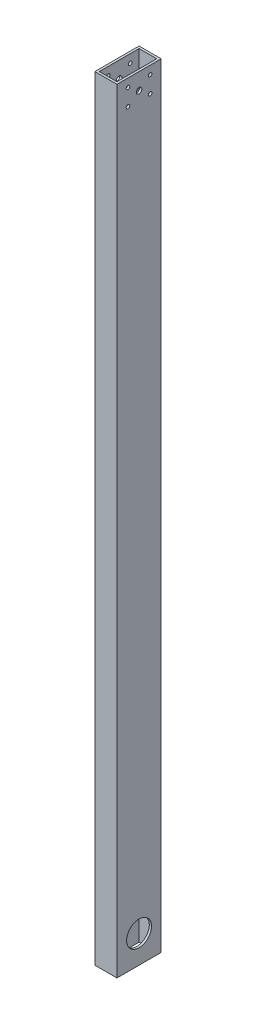
ISO-10303-21;
HEADER;
FILE_DESCRIPTION(('STEP AP214'),'2;1');
FILE_NAME('part.step','',(''),(''),'','','');
FILE_SCHEMA(('AUTOMOTIVE_DESIGN { 1 0 10303 214 1 1 1 1 }'));
ENDSEC;
DATA;
#1=APPLICATION_CONTEXT('core data for automotive mechanical design processes');
#2=APPLICATION_PROTOCOL_DEFINITION('international standard','automotive_design',2000,#1);
#3=PRODUCT_CONTEXT('',#1,'mechanical');
#4=PRODUCT('Part','Part','',(#3));
#5=PRODUCT_RELATED_PRODUCT_CATEGORY('part','',(#4));
#6=PRODUCT_DEFINITION_FORMATION('','',#4);
#7=PRODUCT_DEFINITION_CONTEXT('part definition',#1,'design');
#8=PRODUCT_DEFINITION('design','',#6,#7);
#9=PRODUCT_DEFINITION_SHAPE('','',#8);
#10=(LENGTH_UNIT() NAMED_UNIT(*) SI_UNIT(.MILLI.,.METRE.));
#11=(NAMED_UNIT(*) PLANE_ANGLE_UNIT() SI_UNIT($,.RADIAN.));
#12=(NAMED_UNIT(*) SI_UNIT($,.STERADIAN.) SOLID_ANGLE_UNIT());
#13=UNCERTAINTY_MEASURE_WITH_UNIT(LENGTH_MEASURE(1.E-05),#10,'distance_accuracy_value','');
#14=(GEOMETRIC_REPRESENTATION_CONTEXT(3) GLOBAL_UNCERTAINTY_ASSIGNED_CONTEXT((#13)) GLOBAL_UNIT_ASSIGNED_CONTEXT((#10,
#11,#12)) REPRESENTATION_CONTEXT('',''));
#15=CARTESIAN_POINT('',(0.,0.,0.));
#16=DIRECTION('',(0.,0.,1.));
#17=DIRECTION('',(1.,0.,0.));
#18=AXIS2_PLACEMENT_3D('',#15,#16,#17);
#19=CARTESIAN_POINT('',(12.7,889.,-25.4));
#20=DIRECTION('',(-1.,0.,0.));
#21=DIRECTION('',(0.,0.,1.));
#22=AXIS2_PLACEMENT_3D('',#19,#20,#21);
#23=PLANE('',#22);
#24=CARTESIAN_POINT('',(12.7,879.475,-12.6999999999998));
#25=DIRECTION('',(-1.,0.,0.));
#26=DIRECTION('',(0.,0.,1.));
#27=AXIS2_PLACEMENT_3D('',#24,#25,#26);
#28=CIRCLE('',#27,2.07);
#29=CARTESIAN_POINT('',(12.7,879.475,-10.6299999999998));
#30=VERTEX_POINT('',#29);
#31=EDGE_CURVE('E256',#30,#30,#28,.T.);
#32=ORIENTED_EDGE('',*,*,#31,.T.);
#33=EDGE_LOOP('',(#32));
#34=FACE_BOUND('',#33,.T.);
#35=CARTESIAN_POINT('',(12.7,860.425,-12.6999999999997));
#36=DIRECTION('',(-1.,0.,0.));
#37=DIRECTION('',(0.,0.,1.));
#38=AXIS2_PLACEMENT_3D('',#35,#36,#37);
#39=CIRCLE('',#38,2.07);
#40=CARTESIAN_POINT('',(12.7,860.425,-10.6299999999997));
#41=VERTEX_POINT('',#40);
#42=EDGE_CURVE('E237',#41,#41,#39,.T.);
#43=ORIENTED_EDGE('',*,*,#42,.T.);
#44=EDGE_LOOP('',(#43));
#45=FACE_BOUND('',#44,.T.);
#46=CARTESIAN_POINT('',(12.7,869.95,2.52402265754625E-13));
#47=DIRECTION('',(-1.,0.,0.));
#48=DIRECTION('',(0.,0.,1.));
#49=AXIS2_PLACEMENT_3D('',#46,#47,#48);
#50=CIRCLE('',#49,3.175);
#51=CARTESIAN_POINT('',(12.7,869.95,3.17500000000025));
#52=VERTEX_POINT('',#51);
#53=EDGE_CURVE('E230',#52,#52,#50,.T.);
#54=ORIENTED_EDGE('',*,*,#53,.T.);
#55=EDGE_LOOP('',(#54));
#56=FACE_BOUND('',#55,.T.);
#57=CARTESIAN_POINT('',(12.7,860.425,12.7000000000003));
#58=DIRECTION('',(-1.,0.,0.));
#59=DIRECTION('',(0.,0.,1.));
#60=AXIS2_PLACEMENT_3D('',#57,#58,#59);
#61=CIRCLE('',#60,2.07);
#62=CARTESIAN_POINT('',(12.7,860.425,14.7700000000003));
#63=VERTEX_POINT('',#62);
#64=EDGE_CURVE('E225',#63,#63,#61,.T.);
#65=ORIENTED_EDGE('',*,*,#64,.T.);
#66=EDGE_LOOP('',(#65));
#67=FACE_BOUND('',#66,.T.);
#68=CARTESIAN_POINT('',(12.7,879.475,12.7000000000003));
#69=DIRECTION('',(-1.,0.,0.));
#70=DIRECTION('',(0.,0.,1.));
#71=AXIS2_PLACEMENT_3D('',#68,#69,#70);
#72=CIRCLE('',#71,2.07);
#73=CARTESIAN_POINT('',(12.7,879.475,14.7700000000003));
#74=VERTEX_POINT('',#73);
#75=EDGE_CURVE('E220',#74,#74,#72,.T.);
#76=ORIENTED_EDGE('',*,*,#75,.T.);
#77=EDGE_LOOP('',(#76));
#78=FACE_BOUND('',#77,.T.);
#79=CARTESIAN_POINT('',(12.7,31.75,0.));
#80=DIRECTION('',(-1.,0.,0.));
#81=DIRECTION('',(0.,0.,1.));
#82=AXIS2_PLACEMENT_3D('',#79,#80,#81);
#83=CIRCLE('',#82,14.2875);
#84=CARTESIAN_POINT('',(12.7,31.75,14.2875));
#85=VERTEX_POINT('',#84);
#86=EDGE_CURVE('E165',#85,#85,#83,.T.);
#87=ORIENTED_EDGE('',*,*,#86,.T.);
#88=EDGE_LOOP('',(#87));
#89=FACE_BOUND('',#88,.T.);
#90=DIRECTION('',(0.,0.,-1.));
#91=VECTOR('',#90,1.);
#92=CARTESIAN_POINT('',(12.7,0.,-25.4));
#93=LINE('',#92,#91);
#94=CARTESIAN_POINT('',(12.7,0.,25.4));
#95=VERTEX_POINT('',#94);
#96=CARTESIAN_POINT('',(12.7,0.,-25.4));
#97=VERTEX_POINT('',#96);
#98=EDGE_CURVE('E177',#95,#97,#93,.T.);
#99=ORIENTED_EDGE('',*,*,#98,.T.);
#100=DIRECTION('',(0.,-1.,0.));
#101=VECTOR('',#100,1.);
#102=CARTESIAN_POINT('',(12.7,889.,-25.4));
#103=LINE('',#102,#101);
#104=CARTESIAN_POINT('',(12.7,889.,-25.4));
#105=VERTEX_POINT('',#104);
#106=EDGE_CURVE('E12',#105,#97,#103,.T.);
#107=ORIENTED_EDGE('',*,*,#106,.F.);
#108=DIRECTION('',(0.,0.,-1.));
#109=VECTOR('',#108,1.);
#110=CARTESIAN_POINT('',(12.7,889.,-25.4));
#111=LINE('',#110,#109);
#112=CARTESIAN_POINT('',(12.7,889.,25.4));
#113=VERTEX_POINT('',#112);
#114=EDGE_CURVE('E141',#113,#105,#111,.T.);
#115=ORIENTED_EDGE('',*,*,#114,.F.);
#116=DIRECTION('',(0.,-1.,0.));
#117=VECTOR('',#116,1.);
#118=CARTESIAN_POINT('',(12.7,889.,25.4));
#119=LINE('',#118,#117);
#120=EDGE_CURVE('E188',#113,#95,#119,.T.);
#121=ORIENTED_EDGE('',*,*,#120,.T.);
#122=EDGE_LOOP('',(#99,#107,#115,#121));
#123=FACE_BOUND('',#122,.T.);
#124=ADVANCED_FACE('F58',(#34,#45,#56,#67,#78,#89,#123),#23,.F.);
#125=CARTESIAN_POINT('',(-12.7,889.,-25.4));
#126=DIRECTION('',(0.,0.,1.));
#127=DIRECTION('',(1.,0.,0.));
#128=AXIS2_PLACEMENT_3D('',#125,#126,#127);
#129=PLANE('',#128);
#130=DIRECTION('',(-1.,0.,0.));
#131=VECTOR('',#130,1.);
#132=CARTESIAN_POINT('',(-12.7,0.,-25.4));
#133=LINE('',#132,#131);
#134=CARTESIAN_POINT('',(-12.7,0.,-25.4));
#135=VERTEX_POINT('',#134);
#136=EDGE_CURVE('E147',#97,#135,#133,.T.);
#137=ORIENTED_EDGE('',*,*,#136,.T.);
#138=DIRECTION('',(0.,-1.,0.));
#139=VECTOR('',#138,1.);
#140=CARTESIAN_POINT('',(-12.7,889.,-25.4));
#141=LINE('',#140,#139);
#142=CARTESIAN_POINT('',(-12.7,889.,-25.4));
#143=VERTEX_POINT('',#142);
#144=EDGE_CURVE('E69',#143,#135,#141,.T.);
#145=ORIENTED_EDGE('',*,*,#144,.F.);
#146=DIRECTION('',(-1.,0.,0.));
#147=VECTOR('',#146,1.);
#148=CARTESIAN_POINT('',(-12.7,889.,-25.4));
#149=LINE('',#148,#147);
#150=EDGE_CURVE('E135',#105,#143,#149,.T.);
#151=ORIENTED_EDGE('',*,*,#150,.F.);
#152=ORIENTED_EDGE('',*,*,#106,.T.);
#153=EDGE_LOOP('',(#137,#145,#151,#152));
#154=FACE_BOUND('',#153,.T.);
#155=ADVANCED_FACE('F146',(#154),#129,.F.);
#156=CARTESIAN_POINT('',(-12.7,889.,-25.4));
#157=DIRECTION('',(1.,0.,0.));
#158=DIRECTION('',(0.,0.,-1.));
#159=AXIS2_PLACEMENT_3D('',#156,#157,#158);
#160=PLANE('',#159);
#161=CARTESIAN_POINT('',(-12.7,879.475,-12.6999999999998));
#162=DIRECTION('',(1.,0.,0.));
#163=DIRECTION('',(0.,0.,-1.));
#164=AXIS2_PLACEMENT_3D('',#161,#162,#163);
#165=CIRCLE('',#164,2.07);
#166=CARTESIAN_POINT('',(-12.7,879.475,-14.7699999999998));
#167=VERTEX_POINT('',#166);
#168=EDGE_CURVE('E426',#167,#167,#165,.T.);
#169=ORIENTED_EDGE('',*,*,#168,.T.);
#170=EDGE_LOOP('',(#169));
#171=FACE_BOUND('',#170,.T.);
#172=CARTESIAN_POINT('',(-12.7,860.425,-12.6999999999997));
#173=DIRECTION('',(1.,0.,0.));
#174=DIRECTION('',(0.,0.,-1.));
#175=AXIS2_PLACEMENT_3D('',#172,#173,#174);
#176=CIRCLE('',#175,2.07);
#177=CARTESIAN_POINT('',(-12.7,860.425,-14.7699999999997));
#178=VERTEX_POINT('',#177);
#179=EDGE_CURVE('E430',#178,#178,#176,.T.);
#180=ORIENTED_EDGE('',*,*,#179,.T.);
#181=EDGE_LOOP('',(#180));
#182=FACE_BOUND('',#181,.T.);
#183=CARTESIAN_POINT('',(-12.7,869.95,2.56739074444567E-13));
#184=DIRECTION('',(1.,0.,0.));
#185=DIRECTION('',(0.,0.,-1.));
#186=AXIS2_PLACEMENT_3D('',#183,#184,#185);
#187=CIRCLE('',#186,3.175);
#188=CARTESIAN_POINT('',(-12.7,869.95,-3.17499999999974));
#189=VERTEX_POINT('',#188);
#190=EDGE_CURVE('E434',#189,#189,#187,.T.);
#191=ORIENTED_EDGE('',*,*,#190,.T.);
#192=EDGE_LOOP('',(#191));
#193=FACE_BOUND('',#192,.T.);
#194=CARTESIAN_POINT('',(-12.7,860.425,12.7000000000003));
#195=DIRECTION('',(1.,0.,0.));
#196=DIRECTION('',(0.,0.,-1.));
#197=AXIS2_PLACEMENT_3D('',#194,#195,#196);
#198=CIRCLE('',#197,2.07);
#199=CARTESIAN_POINT('',(-12.7,860.425,10.6300000000003));
#200=VERTEX_POINT('',#199);
#201=EDGE_CURVE('E425',#200,#200,#198,.T.);
#202=ORIENTED_EDGE('',*,*,#201,.T.);
#203=EDGE_LOOP('',(#202));
#204=FACE_BOUND('',#203,.T.);
#205=CARTESIAN_POINT('',(-12.7,879.475,12.7000000000003));
#206=DIRECTION('',(1.,0.,0.));
#207=DIRECTION('',(0.,0.,-1.));
#208=AXIS2_PLACEMENT_3D('',#205,#206,#207);
#209=CIRCLE('',#208,2.07);
#210=CARTESIAN_POINT('',(-12.7,879.475,10.6300000000003));
#211=VERTEX_POINT('',#210);
#212=EDGE_CURVE('E214',#211,#211,#209,.T.);
#213=ORIENTED_EDGE('',*,*,#212,.T.);
#214=EDGE_LOOP('',(#213));
#215=FACE_BOUND('',#214,.T.);
#216=CARTESIAN_POINT('',(-12.7,31.75,0.));
#217=DIRECTION('',(1.,0.,0.));
#218=DIRECTION('',(0.,0.,-1.));
#219=AXIS2_PLACEMENT_3D('',#216,#217,#218);
#220=CIRCLE('',#219,14.2875);
#221=CARTESIAN_POINT('',(-12.7,31.75,-14.2875));
#222=VERTEX_POINT('',#221);
#223=EDGE_CURVE('E208',#222,#222,#220,.T.);
#224=ORIENTED_EDGE('',*,*,#223,.T.);
#225=EDGE_LOOP('',(#224));
#226=FACE_BOUND('',#225,.T.);
#227=DIRECTION('',(0.,0.,1.));
#228=VECTOR('',#227,1.);
#229=CARTESIAN_POINT('',(-12.7,0.,-25.4));
#230=LINE('',#229,#228);
#231=CARTESIAN_POINT('',(-12.7,0.,25.4));
#232=VERTEX_POINT('',#231);
#233=EDGE_CURVE('E107',#135,#232,#230,.T.);
#234=ORIENTED_EDGE('',*,*,#233,.T.);
#235=DIRECTION('',(0.,-1.,0.));
#236=VECTOR('',#235,1.);
#237=CARTESIAN_POINT('',(-12.7,889.,25.4));
#238=LINE('',#237,#236);
#239=CARTESIAN_POINT('',(-12.7,889.,25.4));
#240=VERTEX_POINT('',#239);
#241=EDGE_CURVE('E149',#240,#232,#238,.T.);
#242=ORIENTED_EDGE('',*,*,#241,.F.);
#243=DIRECTION('',(0.,0.,1.));
#244=VECTOR('',#243,1.);
#245=CARTESIAN_POINT('',(-12.7,889.,-25.4));
#246=LINE('',#245,#244);
#247=EDGE_CURVE('E139',#143,#240,#246,.T.);
#248=ORIENTED_EDGE('',*,*,#247,.F.);
#249=ORIENTED_EDGE('',*,*,#144,.T.);
#250=EDGE_LOOP('',(#234,#242,#248,#249));
#251=FACE_BOUND('',#250,.T.);
#252=ADVANCED_FACE('F151',(#171,#182,#193,#204,#215,#226,#251),#160,.F.);
#253=CARTESIAN_POINT('',(-10.16,889.,-22.86));
#254=DIRECTION('',(0.,0.,1.));
#255=DIRECTION('',(1.,0.,0.));
#256=AXIS2_PLACEMENT_3D('',#253,#254,#255);
#257=PLANE('',#256);
#258=DIRECTION('',(-1.,0.,0.));
#259=VECTOR('',#258,1.);
#260=CARTESIAN_POINT('',(-10.16,0.,-22.86));
#261=LINE('',#260,#259);
#262=CARTESIAN_POINT('',(10.16,0.,-22.86));
#263=VERTEX_POINT('',#262);
#264=CARTESIAN_POINT('',(-10.16,0.,-22.86));
#265=VERTEX_POINT('',#264);
#266=EDGE_CURVE('E160',#263,#265,#261,.T.);
#267=ORIENTED_EDGE('',*,*,#266,.F.);
#268=DIRECTION('',(0.,-1.,0.));
#269=VECTOR('',#268,1.);
#270=CARTESIAN_POINT('',(10.16,889.,-22.86));
#271=LINE('',#270,#269);
#272=CARTESIAN_POINT('',(10.16,889.,-22.86));
#273=VERTEX_POINT('',#272);
#274=EDGE_CURVE('E121',#273,#263,#271,.T.);
#275=ORIENTED_EDGE('',*,*,#274,.F.);
#276=DIRECTION('',(-1.,0.,0.));
#277=VECTOR('',#276,1.);
#278=CARTESIAN_POINT('',(-10.16,889.,-22.86));
#279=LINE('',#278,#277);
#280=CARTESIAN_POINT('',(-10.16,889.,-22.86));
#281=VERTEX_POINT('',#280);
#282=EDGE_CURVE('E187',#273,#281,#279,.T.);
#283=ORIENTED_EDGE('',*,*,#282,.T.);
#284=DIRECTION('',(0.,-1.,0.));
#285=VECTOR('',#284,1.);
#286=CARTESIAN_POINT('',(-10.16,889.,-22.86));
#287=LINE('',#286,#285);
#288=EDGE_CURVE('E156',#281,#265,#287,.T.);
#289=ORIENTED_EDGE('',*,*,#288,.T.);
#290=EDGE_LOOP('',(#267,#275,#283,#289));
#291=FACE_BOUND('',#290,.T.);
#292=ADVANCED_FACE('F60',(#291),#257,.T.);
#293=CARTESIAN_POINT('',(10.16,889.,-22.86));
#294=DIRECTION('',(-1.,0.,0.));
#295=DIRECTION('',(0.,0.,1.));
#296=AXIS2_PLACEMENT_3D('',#293,#294,#295);
#297=PLANE('',#296);
#298=CARTESIAN_POINT('',(10.16,879.475,-12.6999999999998));
#299=DIRECTION('',(-1.,0.,0.));
#300=DIRECTION('',(0.,0.,1.));
#301=AXIS2_PLACEMENT_3D('',#298,#299,#300);
#302=CIRCLE('',#301,2.07);
#303=CARTESIAN_POINT('',(10.16,879.475,-10.6299999999998));
#304=VERTEX_POINT('',#303);
#305=EDGE_CURVE('E252',#304,#304,#302,.T.);
#306=ORIENTED_EDGE('',*,*,#305,.F.);
#307=EDGE_LOOP('',(#306));
#308=FACE_BOUND('',#307,.T.);
#309=CARTESIAN_POINT('',(10.16,860.425,-12.6999999999997));
#310=DIRECTION('',(-1.,0.,0.));
#311=DIRECTION('',(0.,0.,1.));
#312=AXIS2_PLACEMENT_3D('',#309,#310,#311);
#313=CIRCLE('',#312,2.07);
#314=CARTESIAN_POINT('',(10.16,860.425,-10.6299999999997));
#315=VERTEX_POINT('',#314);
#316=EDGE_CURVE('E229',#315,#315,#313,.T.);
#317=ORIENTED_EDGE('',*,*,#316,.F.);
#318=EDGE_LOOP('',(#317));
#319=FACE_BOUND('',#318,.T.);
#320=CARTESIAN_POINT('',(10.16,869.95,2.52402265754625E-13));
#321=DIRECTION('',(-1.,0.,0.));
#322=DIRECTION('',(0.,0.,1.));
#323=AXIS2_PLACEMENT_3D('',#320,#321,#322);
#324=CIRCLE('',#323,3.175);
#325=CARTESIAN_POINT('',(10.16,869.95,3.17500000000025));
#326=VERTEX_POINT('',#325);
#327=EDGE_CURVE('E224',#326,#326,#324,.T.);
#328=ORIENTED_EDGE('',*,*,#327,.F.);
#329=EDGE_LOOP('',(#328));
#330=FACE_BOUND('',#329,.T.);
#331=CARTESIAN_POINT('',(10.16,860.425,12.7000000000003));
#332=DIRECTION('',(-1.,0.,0.));
#333=DIRECTION('',(0.,0.,1.));
#334=AXIS2_PLACEMENT_3D('',#331,#332,#333);
#335=CIRCLE('',#334,2.07);
#336=CARTESIAN_POINT('',(10.16,860.425,14.7700000000003));
#337=VERTEX_POINT('',#336);
#338=EDGE_CURVE('E219',#337,#337,#335,.T.);
#339=ORIENTED_EDGE('',*,*,#338,.F.);
#340=EDGE_LOOP('',(#339));
#341=FACE_BOUND('',#340,.T.);
#342=CARTESIAN_POINT('',(10.16,879.475,12.7000000000003));
#343=DIRECTION('',(-1.,0.,0.));
#344=DIRECTION('',(0.,0.,1.));
#345=AXIS2_PLACEMENT_3D('',#342,#343,#344);
#346=CIRCLE('',#345,2.07);
#347=CARTESIAN_POINT('',(10.16,879.475,14.7700000000003));
#348=VERTEX_POINT('',#347);
#349=EDGE_CURVE('E213',#348,#348,#346,.T.);
#350=ORIENTED_EDGE('',*,*,#349,.F.);
#351=EDGE_LOOP('',(#350));
#352=FACE_BOUND('',#351,.T.);
#353=CARTESIAN_POINT('',(10.16,31.75,0.));
#354=DIRECTION('',(-1.,0.,0.));
#355=DIRECTION('',(0.,0.,1.));
#356=AXIS2_PLACEMENT_3D('',#353,#354,#355);
#357=CIRCLE('',#356,14.2875);
#358=CARTESIAN_POINT('',(10.16,31.75,14.2875));
#359=VERTEX_POINT('',#358);
#360=EDGE_CURVE('E207',#359,#359,#357,.T.);
#361=ORIENTED_EDGE('',*,*,#360,.F.);
#362=EDGE_LOOP('',(#361));
#363=FACE_BOUND('',#362,.T.);
#364=DIRECTION('',(0.,0.,-1.));
#365=VECTOR('',#364,1.);
#366=CARTESIAN_POINT('',(10.16,0.,-22.86));
#367=LINE('',#366,#365);
#368=CARTESIAN_POINT('',(10.16,0.,22.86));
#369=VERTEX_POINT('',#368);
#370=EDGE_CURVE('E164',#369,#263,#367,.T.);
#371=ORIENTED_EDGE('',*,*,#370,.F.);
#372=DIRECTION('',(0.,-1.,0.));
#373=VECTOR('',#372,1.);
#374=CARTESIAN_POINT('',(10.16,889.,22.86));
#375=LINE('',#374,#373);
#376=CARTESIAN_POINT('',(10.16,889.,22.86));
#377=VERTEX_POINT('',#376);
#378=EDGE_CURVE('E198',#377,#369,#375,.T.);
#379=ORIENTED_EDGE('',*,*,#378,.F.);
#380=DIRECTION('',(0.,0.,-1.));
#381=VECTOR('',#380,1.);
#382=CARTESIAN_POINT('',(10.16,889.,-22.86));
#383=LINE('',#382,#381);
#384=EDGE_CURVE('E271',#377,#273,#383,.T.);
#385=ORIENTED_EDGE('',*,*,#384,.T.);
#386=ORIENTED_EDGE('',*,*,#274,.T.);
#387=EDGE_LOOP('',(#371,#379,#385,#386));
#388=FACE_BOUND('',#387,.T.);
#389=ADVANCED_FACE('F340',(#308,#319,#330,#341,#352,#363,#388),#297,.T.);
#390=CARTESIAN_POINT('',(-10.16,889.,22.86));
#391=DIRECTION('',(0.,0.,-1.));
#392=DIRECTION('',(-1.,0.,0.));
#393=AXIS2_PLACEMENT_3D('',#390,#391,#392);
#394=PLANE('',#393);
#395=DIRECTION('',(1.,0.,0.));
#396=VECTOR('',#395,1.);
#397=CARTESIAN_POINT('',(-10.16,0.,22.86));
#398=LINE('',#397,#396);
#399=CARTESIAN_POINT('',(-10.16,0.,22.86));
#400=VERTEX_POINT('',#399);
#401=EDGE_CURVE('E169',#400,#369,#398,.T.);
#402=ORIENTED_EDGE('',*,*,#401,.F.);
#403=DIRECTION('',(0.,-1.,0.));
#404=VECTOR('',#403,1.);
#405=CARTESIAN_POINT('',(-10.16,889.,22.86));
#406=LINE('',#405,#404);
#407=CARTESIAN_POINT('',(-10.16,889.,22.86));
#408=VERTEX_POINT('',#407);
#409=EDGE_CURVE('E195',#408,#400,#406,.T.);
#410=ORIENTED_EDGE('',*,*,#409,.F.);
#411=DIRECTION('',(1.,0.,0.));
#412=VECTOR('',#411,1.);
#413=CARTESIAN_POINT('',(-10.16,889.,22.86));
#414=LINE('',#413,#412);
#415=EDGE_CURVE('E275',#408,#377,#414,.T.);
#416=ORIENTED_EDGE('',*,*,#415,.T.);
#417=ORIENTED_EDGE('',*,*,#378,.T.);
#418=EDGE_LOOP('',(#402,#410,#416,#417));
#419=FACE_BOUND('',#418,.T.);
#420=ADVANCED_FACE('F317',(#419),#394,.T.);
#421=CARTESIAN_POINT('',(-10.16,889.,-22.86));
#422=DIRECTION('',(1.,0.,0.));
#423=DIRECTION('',(0.,0.,-1.));
#424=AXIS2_PLACEMENT_3D('',#421,#422,#423);
#425=PLANE('',#424);
#426=CARTESIAN_POINT('',(-10.16,879.475,-12.6999999999998));
#427=DIRECTION('',(1.,0.,0.));
#428=DIRECTION('',(0.,0.,-1.));
#429=AXIS2_PLACEMENT_3D('',#426,#427,#428);
#430=CIRCLE('',#429,2.07);
#431=CARTESIAN_POINT('',(-10.16,879.475,-14.7699999999998));
#432=VERTEX_POINT('',#431);
#433=EDGE_CURVE('E62',#432,#432,#430,.T.);
#434=ORIENTED_EDGE('',*,*,#433,.F.);
#435=EDGE_LOOP('',(#434));
#436=FACE_BOUND('',#435,.T.);
#437=CARTESIAN_POINT('',(-10.16,860.425,-12.6999999999997));
#438=DIRECTION('',(1.,0.,0.));
#439=DIRECTION('',(0.,0.,-1.));
#440=AXIS2_PLACEMENT_3D('',#437,#438,#439);
#441=CIRCLE('',#440,2.07);
#442=CARTESIAN_POINT('',(-10.16,860.425,-14.7699999999997));
#443=VERTEX_POINT('',#442);
#444=EDGE_CURVE('E226',#443,#443,#441,.T.);
#445=ORIENTED_EDGE('',*,*,#444,.F.);
#446=EDGE_LOOP('',(#445));
#447=FACE_BOUND('',#446,.T.);
#448=CARTESIAN_POINT('',(-10.16,869.95,2.55871712706579E-13));
#449=DIRECTION('',(1.,0.,0.));
#450=DIRECTION('',(0.,0.,-1.));
#451=AXIS2_PLACEMENT_3D('',#448,#449,#450);
#452=CIRCLE('',#451,3.175);
#453=CARTESIAN_POINT('',(-10.16,869.95,-3.17499999999974));
#454=VERTEX_POINT('',#453);
#455=EDGE_CURVE('E221',#454,#454,#452,.T.);
#456=ORIENTED_EDGE('',*,*,#455,.F.);
#457=EDGE_LOOP('',(#456));
#458=FACE_BOUND('',#457,.T.);
#459=CARTESIAN_POINT('',(-10.16,860.425,12.7000000000003));
#460=DIRECTION('',(1.,0.,0.));
#461=DIRECTION('',(0.,0.,-1.));
#462=AXIS2_PLACEMENT_3D('',#459,#460,#461);
#463=CIRCLE('',#462,2.07);
#464=CARTESIAN_POINT('',(-10.16,860.425,10.6300000000003));
#465=VERTEX_POINT('',#464);
#466=EDGE_CURVE('E215',#465,#465,#463,.T.);
#467=ORIENTED_EDGE('',*,*,#466,.F.);
#468=EDGE_LOOP('',(#467));
#469=FACE_BOUND('',#468,.T.);
#470=CARTESIAN_POINT('',(-10.16,879.475,12.7000000000003));
#471=DIRECTION('',(1.,0.,0.));
#472=DIRECTION('',(0.,0.,-1.));
#473=AXIS2_PLACEMENT_3D('',#470,#471,#472);
#474=CIRCLE('',#473,2.07);
#475=CARTESIAN_POINT('',(-10.16,879.475,10.6300000000003));
#476=VERTEX_POINT('',#475);
#477=EDGE_CURVE('E209',#476,#476,#474,.T.);
#478=ORIENTED_EDGE('',*,*,#477,.F.);
#479=EDGE_LOOP('',(#478));
#480=FACE_BOUND('',#479,.T.);
#481=CARTESIAN_POINT('',(-10.16,31.75,0.));
#482=DIRECTION('',(1.,0.,0.));
#483=DIRECTION('',(0.,0.,-1.));
#484=AXIS2_PLACEMENT_3D('',#481,#482,#483);
#485=CIRCLE('',#484,14.2875);
#486=CARTESIAN_POINT('',(-10.16,31.75,-14.2875));
#487=VERTEX_POINT('',#486);
#488=EDGE_CURVE('E203',#487,#487,#485,.T.);
#489=ORIENTED_EDGE('',*,*,#488,.F.);
#490=EDGE_LOOP('',(#489));
#491=FACE_BOUND('',#490,.T.);
#492=DIRECTION('',(0.,0.,1.));
#493=VECTOR('',#492,1.);
#494=CARTESIAN_POINT('',(-10.16,0.,-22.86));
#495=LINE('',#494,#493);
#496=EDGE_CURVE('E173',#265,#400,#495,.T.);
#497=ORIENTED_EDGE('',*,*,#496,.F.);
#498=ORIENTED_EDGE('',*,*,#288,.F.);
#499=DIRECTION('',(0.,0.,1.));
#500=VECTOR('',#499,1.);
#501=CARTESIAN_POINT('',(-10.16,889.,-22.86));
#502=LINE('',#501,#500);
#503=EDGE_CURVE('E279',#281,#408,#502,.T.);
#504=ORIENTED_EDGE('',*,*,#503,.T.);
#505=ORIENTED_EDGE('',*,*,#409,.T.);
#506=EDGE_LOOP('',(#497,#498,#504,#505));
#507=FACE_BOUND('',#506,.T.);
#508=ADVANCED_FACE('F313',(#436,#447,#458,#469,#480,#491,#507),#425,.T.);
#509=CARTESIAN_POINT('',(-12.7,889.,25.4));
#510=DIRECTION('',(0.,0.,-1.));
#511=DIRECTION('',(-1.,0.,0.));
#512=AXIS2_PLACEMENT_3D('',#509,#510,#511);
#513=PLANE('',#512);
#514=DIRECTION('',(1.,0.,0.));
#515=VECTOR('',#514,1.);
#516=CARTESIAN_POINT('',(-12.7,0.,25.4));
#517=LINE('',#516,#515);
#518=EDGE_CURVE('E113',#232,#95,#517,.T.);
#519=ORIENTED_EDGE('',*,*,#518,.T.);
#520=ORIENTED_EDGE('',*,*,#120,.F.);
#521=DIRECTION('',(1.,0.,0.));
#522=VECTOR('',#521,1.);
#523=CARTESIAN_POINT('',(-12.7,889.,25.4));
#524=LINE('',#523,#522);
#525=EDGE_CURVE('E78',#240,#113,#524,.T.);
#526=ORIENTED_EDGE('',*,*,#525,.F.);
#527=ORIENTED_EDGE('',*,*,#241,.T.);
#528=EDGE_LOOP('',(#519,#520,#526,#527));
#529=FACE_BOUND('',#528,.T.);
#530=ADVANCED_FACE('F316',(#529),#513,.F.);
#531=CARTESIAN_POINT('',(0.,889.,0.));
#532=DIRECTION('',(0.,1.,0.));
#533=DIRECTION('',(0.,0.,1.));
#534=AXIS2_PLACEMENT_3D('',#531,#532,#533);
#535=PLANE('',#534);
#536=ORIENTED_EDGE('',*,*,#282,.F.);
#537=ORIENTED_EDGE('',*,*,#384,.F.);
#538=ORIENTED_EDGE('',*,*,#415,.F.);
#539=ORIENTED_EDGE('',*,*,#503,.F.);
#540=EDGE_LOOP('',(#536,#537,#538,#539));
#541=FACE_BOUND('',#540,.T.);
#542=ORIENTED_EDGE('',*,*,#114,.T.);
#543=ORIENTED_EDGE('',*,*,#150,.T.);
#544=ORIENTED_EDGE('',*,*,#247,.T.);
#545=ORIENTED_EDGE('',*,*,#525,.T.);
#546=EDGE_LOOP('',(#542,#543,#544,#545));
#547=FACE_BOUND('',#546,.T.);
#548=ADVANCED_FACE('F137',(#541,#547),#535,.T.);
#549=CARTESIAN_POINT('',(0.,0.,0.));
#550=DIRECTION('',(0.,1.,0.));
#551=DIRECTION('',(0.,0.,1.));
#552=AXIS2_PLACEMENT_3D('',#549,#550,#551);
#553=PLANE('',#552);
#554=ORIENTED_EDGE('',*,*,#266,.T.);
#555=ORIENTED_EDGE('',*,*,#496,.T.);
#556=ORIENTED_EDGE('',*,*,#401,.T.);
#557=ORIENTED_EDGE('',*,*,#370,.T.);
#558=EDGE_LOOP('',(#554,#555,#556,#557));
#559=FACE_BOUND('',#558,.T.);
#560=ORIENTED_EDGE('',*,*,#98,.F.);
#561=ORIENTED_EDGE('',*,*,#518,.F.);
#562=ORIENTED_EDGE('',*,*,#233,.F.);
#563=ORIENTED_EDGE('',*,*,#136,.F.);
#564=EDGE_LOOP('',(#560,#561,#562,#563));
#565=FACE_BOUND('',#564,.T.);
#566=ADVANCED_FACE('F331',(#559,#565),#553,.F.);
#567=CARTESIAN_POINT('',(-12.7,31.75,0.));
#568=DIRECTION('',(1.,0.,0.));
#569=DIRECTION('',(0.,0.,-1.));
#570=AXIS2_PLACEMENT_3D('',#567,#568,#569);
#571=CYLINDRICAL_SURFACE('',#570,14.2875);
#572=ORIENTED_EDGE('',*,*,#488,.T.);
#573=EDGE_LOOP('',(#572));
#574=FACE_BOUND('',#573,.T.);
#575=ORIENTED_EDGE('',*,*,#223,.F.);
#576=EDGE_LOOP('',(#575));
#577=FACE_BOUND('',#576,.T.);
#578=ADVANCED_FACE('F366',(#574,#577),#571,.F.);
#579=ORIENTED_EDGE('',*,*,#360,.T.);
#580=EDGE_LOOP('',(#579));
#581=FACE_BOUND('',#580,.T.);
#582=ORIENTED_EDGE('',*,*,#86,.F.);
#583=EDGE_LOOP('',(#582));
#584=FACE_BOUND('',#583,.T.);
#585=ADVANCED_FACE('F371',(#581,#584),#571,.F.);
#586=CARTESIAN_POINT('',(-12.7,879.475,12.7000000000003));
#587=DIRECTION('',(1.,0.,0.));
#588=DIRECTION('',(0.,0.,-1.));
#589=AXIS2_PLACEMENT_3D('',#586,#587,#588);
#590=CYLINDRICAL_SURFACE('',#589,2.07);
#591=ORIENTED_EDGE('',*,*,#477,.T.);
#592=EDGE_LOOP('',(#591));
#593=FACE_BOUND('',#592,.T.);
#594=ORIENTED_EDGE('',*,*,#212,.F.);
#595=EDGE_LOOP('',(#594));
#596=FACE_BOUND('',#595,.T.);
#597=ADVANCED_FACE('F373',(#593,#596),#590,.F.);
#598=CARTESIAN_POINT('',(-12.7,860.425,12.7000000000003));
#599=DIRECTION('',(1.,0.,0.));
#600=DIRECTION('',(0.,0.,-1.));
#601=AXIS2_PLACEMENT_3D('',#598,#599,#600);
#602=CYLINDRICAL_SURFACE('',#601,2.07);
#603=ORIENTED_EDGE('',*,*,#466,.T.);
#604=EDGE_LOOP('',(#603));
#605=FACE_BOUND('',#604,.T.);
#606=ORIENTED_EDGE('',*,*,#201,.F.);
#607=EDGE_LOOP('',(#606));
#608=FACE_BOUND('',#607,.T.);
#609=ADVANCED_FACE('F376',(#605,#608),#602,.F.);
#610=CARTESIAN_POINT('',(-12.7,869.95,2.56739074444567E-13));
#611=DIRECTION('',(1.,0.,0.));
#612=DIRECTION('',(0.,0.,-1.));
#613=AXIS2_PLACEMENT_3D('',#610,#611,#612);
#614=CYLINDRICAL_SURFACE('',#613,3.175);
#615=ORIENTED_EDGE('',*,*,#455,.T.);
#616=EDGE_LOOP('',(#615));
#617=FACE_BOUND('',#616,.T.);
#618=ORIENTED_EDGE('',*,*,#190,.F.);
#619=EDGE_LOOP('',(#618));
#620=FACE_BOUND('',#619,.T.);
#621=ADVANCED_FACE('F385',(#617,#620),#614,.F.);
#622=CARTESIAN_POINT('',(-12.7,860.425,-12.6999999999997));
#623=DIRECTION('',(1.,0.,0.));
#624=DIRECTION('',(0.,0.,-1.));
#625=AXIS2_PLACEMENT_3D('',#622,#623,#624);
#626=CYLINDRICAL_SURFACE('',#625,2.07);
#627=ORIENTED_EDGE('',*,*,#444,.T.);
#628=EDGE_LOOP('',(#627));
#629=FACE_BOUND('',#628,.T.);
#630=ORIENTED_EDGE('',*,*,#179,.F.);
#631=EDGE_LOOP('',(#630));
#632=FACE_BOUND('',#631,.T.);
#633=ADVANCED_FACE('F381',(#629,#632),#626,.F.);
#634=CARTESIAN_POINT('',(-12.7,879.475,-12.6999999999998));
#635=DIRECTION('',(1.,0.,0.));
#636=DIRECTION('',(0.,0.,-1.));
#637=AXIS2_PLACEMENT_3D('',#634,#635,#636);
#638=CYLINDRICAL_SURFACE('',#637,2.07);
#639=ORIENTED_EDGE('',*,*,#433,.T.);
#640=EDGE_LOOP('',(#639));
#641=FACE_BOUND('',#640,.T.);
#642=ORIENTED_EDGE('',*,*,#168,.F.);
#643=EDGE_LOOP('',(#642));
#644=FACE_BOUND('',#643,.T.);
#645=ADVANCED_FACE('F310',(#641,#644),#638,.F.);
#646=ORIENTED_EDGE('',*,*,#349,.T.);
#647=EDGE_LOOP('',(#646));
#648=FACE_BOUND('',#647,.T.);
#649=ORIENTED_EDGE('',*,*,#75,.F.);
#650=EDGE_LOOP('',(#649));
#651=FACE_BOUND('',#650,.T.);
#652=ADVANCED_FACE('F378',(#648,#651),#590,.F.);
#653=ORIENTED_EDGE('',*,*,#338,.T.);
#654=EDGE_LOOP('',(#653));
#655=FACE_BOUND('',#654,.T.);
#656=ORIENTED_EDGE('',*,*,#64,.F.);
#657=EDGE_LOOP('',(#656));
#658=FACE_BOUND('',#657,.T.);
#659=ADVANCED_FACE('F393',(#655,#658),#602,.F.);
#660=ORIENTED_EDGE('',*,*,#327,.T.);
#661=EDGE_LOOP('',(#660));
#662=FACE_BOUND('',#661,.T.);
#663=ORIENTED_EDGE('',*,*,#53,.F.);
#664=EDGE_LOOP('',(#663));
#665=FACE_BOUND('',#664,.T.);
#666=ADVANCED_FACE('F390',(#662,#665),#614,.F.);
#667=ORIENTED_EDGE('',*,*,#316,.T.);
#668=EDGE_LOOP('',(#667));
#669=FACE_BOUND('',#668,.T.);
#670=ORIENTED_EDGE('',*,*,#42,.F.);
#671=EDGE_LOOP('',(#670));
#672=FACE_BOUND('',#671,.T.);
#673=ADVANCED_FACE('F386',(#669,#672),#626,.F.);
#674=ORIENTED_EDGE('',*,*,#305,.T.);
#675=EDGE_LOOP('',(#674));
#676=FACE_BOUND('',#675,.T.);
#677=ORIENTED_EDGE('',*,*,#31,.F.);
#678=EDGE_LOOP('',(#677));
#679=FACE_BOUND('',#678,.T.);
#680=ADVANCED_FACE('F382',(#676,#679),#638,.F.);
#681=CLOSED_SHELL('',(#124,#155,#252,#292,#389,#420,#508,#530,#548,#566,#578,#585,#597,#609,
#621,#633,#645,#652,#659,#666,#673,#680));
#682=MANIFOLD_SOLID_BREP('B2',#681);
#683=ADVANCED_BREP_SHAPE_REPRESENTATION('',(#18,#682),#14);
#684=SHAPE_DEFINITION_REPRESENTATION(#9,#683);
ENDSEC;
END-ISO-10303-21;
